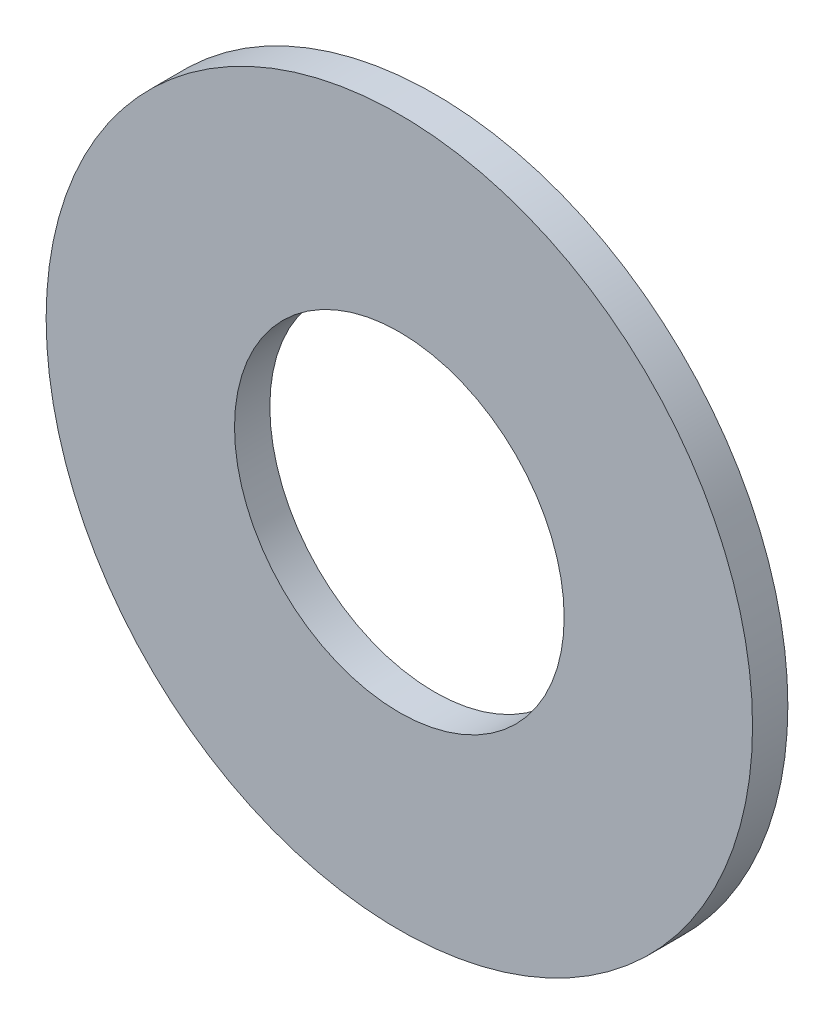
ISO-10303-21;
HEADER;
FILE_DESCRIPTION(('STEP AP214'),'2;1');
FILE_NAME('part.step','',(''),(''),'','','');
FILE_SCHEMA(('AUTOMOTIVE_DESIGN { 1 0 10303 214 1 1 1 1 }'));
ENDSEC;
DATA;
#1=APPLICATION_CONTEXT('core data for automotive mechanical design processes');
#2=APPLICATION_PROTOCOL_DEFINITION('international standard','automotive_design',2000,#1);
#3=PRODUCT_CONTEXT('',#1,'mechanical');
#4=PRODUCT('Part','Part','',(#3));
#5=PRODUCT_RELATED_PRODUCT_CATEGORY('part','',(#4));
#6=PRODUCT_DEFINITION_FORMATION('','',#4);
#7=PRODUCT_DEFINITION_CONTEXT('part definition',#1,'design');
#8=PRODUCT_DEFINITION('design','',#6,#7);
#9=PRODUCT_DEFINITION_SHAPE('','',#8);
#10=(LENGTH_UNIT() NAMED_UNIT(*) SI_UNIT(.MILLI.,.METRE.));
#11=(NAMED_UNIT(*) PLANE_ANGLE_UNIT() SI_UNIT($,.RADIAN.));
#12=(NAMED_UNIT(*) SI_UNIT($,.STERADIAN.) SOLID_ANGLE_UNIT());
#13=UNCERTAINTY_MEASURE_WITH_UNIT(LENGTH_MEASURE(1.E-05),#10,'distance_accuracy_value','');
#14=(GEOMETRIC_REPRESENTATION_CONTEXT(3) GLOBAL_UNCERTAINTY_ASSIGNED_CONTEXT((#13)) GLOBAL_UNIT_ASSIGNED_CONTEXT((#10,
#11,#12)) REPRESENTATION_CONTEXT('',''));
#15=CARTESIAN_POINT('',(0.,0.,0.));
#16=DIRECTION('',(0.,0.,1.));
#17=DIRECTION('',(1.,0.,0.));
#18=AXIS2_PLACEMENT_3D('',#15,#16,#17);
#19=CARTESIAN_POINT('',(0.,0.,-1.5));
#20=DIRECTION('',(0.,0.,1.));
#21=DIRECTION('',(1.,0.,0.));
#22=AXIS2_PLACEMENT_3D('',#19,#20,#21);
#23=CYLINDRICAL_SURFACE('',#22,14.);
#24=CARTESIAN_POINT('',(0.,0.,1.5));
#25=DIRECTION('',(0.,0.,1.));
#26=DIRECTION('',(1.,0.,0.));
#27=AXIS2_PLACEMENT_3D('',#24,#25,#26);
#28=CIRCLE('',#27,14.);
#29=CARTESIAN_POINT('',(14.,0.,1.5));
#30=VERTEX_POINT('',#29);
#31=EDGE_CURVE('E10',#30,#30,#28,.T.);
#32=ORIENTED_EDGE('',*,*,#31,.T.);
#33=EDGE_LOOP('',(#32));
#34=FACE_BOUND('',#33,.T.);
#35=CARTESIAN_POINT('',(0.,0.,-1.5));
#36=DIRECTION('',(0.,0.,1.));
#37=DIRECTION('',(1.,0.,0.));
#38=AXIS2_PLACEMENT_3D('',#35,#36,#37);
#39=CIRCLE('',#38,14.);
#40=CARTESIAN_POINT('',(14.,0.,-1.5));
#41=VERTEX_POINT('',#40);
#42=EDGE_CURVE('E45',#41,#41,#39,.T.);
#43=ORIENTED_EDGE('',*,*,#42,.F.);
#44=EDGE_LOOP('',(#43));
#45=FACE_BOUND('',#44,.T.);
#46=ADVANCED_FACE('F31',(#34,#45),#23,.F.);
#47=CARTESIAN_POINT('',(14.,0.,1.5));
#48=DIRECTION('',(0.,0.,1.));
#49=DIRECTION('',(1.,0.,0.));
#50=AXIS2_PLACEMENT_3D('',#47,#48,#49);
#51=PLANE('',#50);
#52=CARTESIAN_POINT('',(0.,0.,1.5));
#53=DIRECTION('',(0.,0.,1.));
#54=DIRECTION('',(1.,0.,0.));
#55=AXIS2_PLACEMENT_3D('',#52,#53,#54);
#56=CIRCLE('',#55,30.);
#57=CARTESIAN_POINT('',(30.,0.,1.5));
#58=VERTEX_POINT('',#57);
#59=EDGE_CURVE('E37',#58,#58,#56,.T.);
#60=ORIENTED_EDGE('',*,*,#59,.T.);
#61=EDGE_LOOP('',(#60));
#62=FACE_BOUND('',#61,.T.);
#63=ORIENTED_EDGE('',*,*,#31,.F.);
#64=EDGE_LOOP('',(#63));
#65=FACE_BOUND('',#64,.T.);
#66=ADVANCED_FACE('F55',(#62,#65),#51,.T.);
#67=CARTESIAN_POINT('',(0.,0.,-1.5));
#68=DIRECTION('',(0.,0.,1.));
#69=DIRECTION('',(1.,0.,0.));
#70=AXIS2_PLACEMENT_3D('',#67,#68,#69);
#71=CYLINDRICAL_SURFACE('',#70,30.);
#72=CARTESIAN_POINT('',(0.,0.,-1.5));
#73=DIRECTION('',(0.,0.,1.));
#74=DIRECTION('',(1.,0.,0.));
#75=AXIS2_PLACEMENT_3D('',#72,#73,#74);
#76=CIRCLE('',#75,30.);
#77=CARTESIAN_POINT('',(30.,0.,-1.5));
#78=VERTEX_POINT('',#77);
#79=EDGE_CURVE('E41',#78,#78,#76,.T.);
#80=ORIENTED_EDGE('',*,*,#79,.T.);
#81=EDGE_LOOP('',(#80));
#82=FACE_BOUND('',#81,.T.);
#83=ORIENTED_EDGE('',*,*,#59,.F.);
#84=EDGE_LOOP('',(#83));
#85=FACE_BOUND('',#84,.T.);
#86=ADVANCED_FACE('F59',(#82,#85),#71,.T.);
#87=CARTESIAN_POINT('',(30.,0.,-1.5));
#88=DIRECTION('',(0.,0.,-1.));
#89=DIRECTION('',(-1.,0.,0.));
#90=AXIS2_PLACEMENT_3D('',#87,#88,#89);
#91=PLANE('',#90);
#92=ORIENTED_EDGE('',*,*,#42,.T.);
#93=EDGE_LOOP('',(#92));
#94=FACE_BOUND('',#93,.T.);
#95=ORIENTED_EDGE('',*,*,#79,.F.);
#96=EDGE_LOOP('',(#95));
#97=FACE_BOUND('',#96,.T.);
#98=ADVANCED_FACE('F51',(#94,#97),#91,.T.);
#99=CLOSED_SHELL('',(#46,#66,#86,#98));
#100=MANIFOLD_SOLID_BREP('B2',#99);
#101=ADVANCED_BREP_SHAPE_REPRESENTATION('',(#18,#100),#14);
#102=SHAPE_DEFINITION_REPRESENTATION(#9,#101);
ENDSEC;
END-ISO-10303-21;
